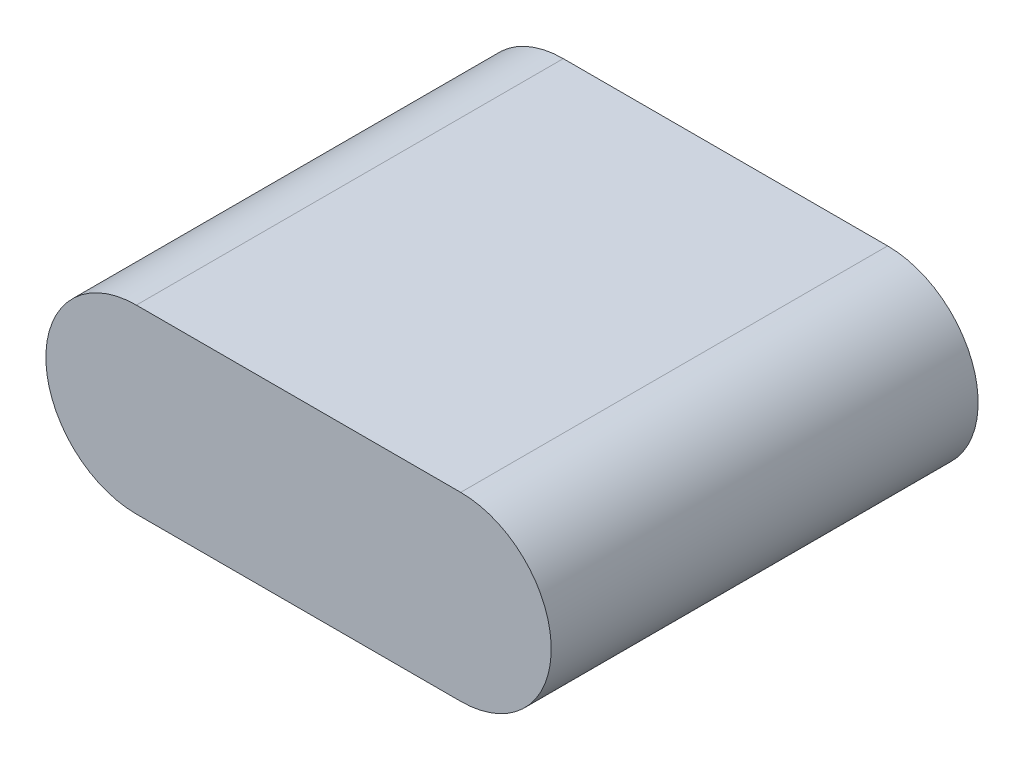
ISO-10303-21;
HEADER;
FILE_DESCRIPTION(('STEP AP214'),'2;1');
FILE_NAME('part.step','',(''),(''),'','','');
FILE_SCHEMA(('AUTOMOTIVE_DESIGN { 1 0 10303 214 1 1 1 1 }'));
ENDSEC;
DATA;
#1=APPLICATION_CONTEXT('core data for automotive mechanical design processes');
#2=APPLICATION_PROTOCOL_DEFINITION('international standard','automotive_design',2000,#1);
#3=PRODUCT_CONTEXT('',#1,'mechanical');
#4=PRODUCT('Part','Part','',(#3));
#5=PRODUCT_RELATED_PRODUCT_CATEGORY('part','',(#4));
#6=PRODUCT_DEFINITION_FORMATION('','',#4);
#7=PRODUCT_DEFINITION_CONTEXT('part definition',#1,'design');
#8=PRODUCT_DEFINITION('design','',#6,#7);
#9=PRODUCT_DEFINITION_SHAPE('','',#8);
#10=(LENGTH_UNIT() NAMED_UNIT(*) SI_UNIT(.MILLI.,.METRE.));
#11=(NAMED_UNIT(*) PLANE_ANGLE_UNIT() SI_UNIT($,.RADIAN.));
#12=(NAMED_UNIT(*) SI_UNIT($,.STERADIAN.) SOLID_ANGLE_UNIT());
#13=UNCERTAINTY_MEASURE_WITH_UNIT(LENGTH_MEASURE(1.E-05),#10,'distance_accuracy_value','');
#14=(GEOMETRIC_REPRESENTATION_CONTEXT(3) GLOBAL_UNCERTAINTY_ASSIGNED_CONTEXT((#13)) GLOBAL_UNIT_ASSIGNED_CONTEXT((#10,
#11,#12)) REPRESENTATION_CONTEXT('',''));
#15=CARTESIAN_POINT('',(0.,0.,0.));
#16=DIRECTION('',(0.,0.,1.));
#17=DIRECTION('',(1.,0.,0.));
#18=AXIS2_PLACEMENT_3D('',#15,#16,#17);
#19=CARTESIAN_POINT('',(-260.03431365079,39.5101937963928,-333.831395650827));
#20=DIRECTION('',(-1.90958360235527E-13,-3.56992213568219E-13,1.));
#21=DIRECTION('',(0.,1.,3.56992213568219E-13));
#22=AXIS2_PLACEMENT_3D('',#19,#20,#21);
#23=PLANE('',#22);
#24=CARTESIAN_POINT('',(-260.03431365079,39.5101937963928,-333.831395650827));
#25=DIRECTION('',(1.90958360235527E-13,3.56992213568219E-13,-1.));
#26=DIRECTION('',(0.,1.,3.56992213568219E-13));
#27=AXIS2_PLACEMENT_3D('',#24,#25,#26);
#28=CIRCLE('',#27,50.);
#29=CARTESIAN_POINT('',(-260.03431365079,-10.4898062036072,-333.831395650844));
#30=VERTEX_POINT('',#29);
#31=CARTESIAN_POINT('',(-260.03431365079,89.5101937963928,-333.831395650809));
#32=VERTEX_POINT('',#31);
#33=EDGE_CURVE('E165',#30,#32,#28,.T.);
#34=ORIENTED_EDGE('',*,*,#33,.T.);
#35=DIRECTION('',(1.,0.,1.9099669192392E-13));
#36=VECTOR('',#35,1.);
#37=CARTESIAN_POINT('',(-260.03431365079,89.5101937963928,-333.831395650809));
#38=LINE('',#37,#36);
#39=CARTESIAN_POINT('',(-80.8551645810129,89.5101937963928,-333.831395650775));
#40=VERTEX_POINT('',#39);
#41=EDGE_CURVE('E11',#32,#40,#38,.T.);
#42=ORIENTED_EDGE('',*,*,#41,.T.);
#43=CARTESIAN_POINT('',(-80.8551645810128,39.5101937963928,-333.831395650792));
#44=DIRECTION('',(1.90958360235527E-13,3.56992213568219E-13,-1.));
#45=DIRECTION('',(0.,1.,3.56992213568219E-13));
#46=AXIS2_PLACEMENT_3D('',#43,#44,#45);
#47=CIRCLE('',#46,50.);
#48=CARTESIAN_POINT('',(-80.8551645810129,-10.4898062036072,-333.83139565081));
#49=VERTEX_POINT('',#48);
#50=EDGE_CURVE('E42',#40,#49,#47,.T.);
#51=ORIENTED_EDGE('',*,*,#50,.T.);
#52=DIRECTION('',(-1.,0.,-1.9099669192392E-13));
#53=VECTOR('',#52,1.);
#54=CARTESIAN_POINT('',(-80.8551645810129,-10.4898062036072,-333.83139565081));
#55=LINE('',#54,#53);
#56=EDGE_CURVE('E155',#49,#30,#55,.T.);
#57=ORIENTED_EDGE('',*,*,#56,.T.);
#58=EDGE_LOOP('',(#34,#42,#51,#57));
#59=FACE_BOUND('',#58,.T.);
#60=ADVANCED_FACE('F33',(#59),#23,.F.);
#61=CARTESIAN_POINT('',(-260.03431365079,39.5101937963928,-97.9999899999562));
#62=DIRECTION('',(-1.90958360235527E-13,-3.56992213568219E-13,-1.));
#63=DIRECTION('',(0.,1.,-3.56992213568219E-13));
#64=AXIS2_PLACEMENT_3D('',#61,#62,#63);
#65=PLANE('',#64);
#66=CARTESIAN_POINT('',(-260.03431365079,39.5101937963928,-97.9999899999562));
#67=DIRECTION('',(-1.90958360235527E-13,-3.56992213568219E-13,-1.));
#68=DIRECTION('',(0.,1.,-3.56992213568219E-13));
#69=AXIS2_PLACEMENT_3D('',#66,#67,#68);
#70=CIRCLE('',#69,50.);
#71=CARTESIAN_POINT('',(-260.03431365079,-10.4898062036072,-97.9999899999384));
#72=VERTEX_POINT('',#71);
#73=CARTESIAN_POINT('',(-260.03431365079,89.5101937963928,-97.999989999974));
#74=VERTEX_POINT('',#73);
#75=EDGE_CURVE('E80',#72,#74,#70,.T.);
#76=ORIENTED_EDGE('',*,*,#75,.F.);
#77=DIRECTION('',(-1.,0.,1.9099669192392E-13));
#78=VECTOR('',#77,1.);
#79=CARTESIAN_POINT('',(-80.8551645810129,-10.4898062036072,-97.9999899999726));
#80=LINE('',#79,#78);
#81=CARTESIAN_POINT('',(-80.8551645810129,-10.4898062036072,-97.9999899999726));
#82=VERTEX_POINT('',#81);
#83=EDGE_CURVE('E101',#82,#72,#80,.T.);
#84=ORIENTED_EDGE('',*,*,#83,.F.);
#85=CARTESIAN_POINT('',(-80.8551645810128,39.5101937963928,-97.9999899999904));
#86=DIRECTION('',(-1.90958360235527E-13,-3.56992213568219E-13,-1.));
#87=DIRECTION('',(0.,1.,-3.56992213568219E-13));
#88=AXIS2_PLACEMENT_3D('',#85,#86,#87);
#89=CIRCLE('',#88,50.);
#90=CARTESIAN_POINT('',(-80.8551645810129,89.5101937963928,-97.9999900000083));
#91=VERTEX_POINT('',#90);
#92=EDGE_CURVE('E83',#91,#82,#89,.T.);
#93=ORIENTED_EDGE('',*,*,#92,.F.);
#94=DIRECTION('',(1.,0.,-1.9099669192392E-13));
#95=VECTOR('',#94,1.);
#96=CARTESIAN_POINT('',(-260.03431365079,89.5101937963928,-97.999989999974));
#97=LINE('',#96,#95);
#98=EDGE_CURVE('E77',#74,#91,#97,.T.);
#99=ORIENTED_EDGE('',*,*,#98,.F.);
#100=EDGE_LOOP('',(#76,#84,#93,#99));
#101=FACE_BOUND('',#100,.T.);
#102=ADVANCED_FACE('F79',(#101),#65,.F.);
#103=CARTESIAN_POINT('',(-260.03431365079,39.5101937963928,-97.9999899999562));
#104=DIRECTION('',(-1.90958360235527E-13,-3.56992213568219E-13,-1.));
#105=DIRECTION('',(0.,1.,-3.56992213568219E-13));
#106=AXIS2_PLACEMENT_3D('',#103,#104,#105);
#107=CYLINDRICAL_SURFACE('',#106,49.9999999999579);
#108=DIRECTION('',(-3.81916720471053E-13,-7.13984427136439E-13,-1.));
#109=VECTOR('',#108,1.);
#110=CARTESIAN_POINT('',(-260.03431365079,89.5101937963928,-97.999989999974));
#111=LINE('',#110,#109);
#112=EDGE_CURVE('E50',#74,#32,#111,.T.);
#113=ORIENTED_EDGE('',*,*,#112,.T.);
#114=ORIENTED_EDGE('',*,*,#33,.F.);
#115=DIRECTION('',(0.,0.,-1.));
#116=VECTOR('',#115,1.);
#117=CARTESIAN_POINT('',(-260.03431365079,-10.4898062036072,-97.9999899999384));
#118=LINE('',#117,#116);
#119=EDGE_CURVE('E95',#72,#30,#118,.T.);
#120=ORIENTED_EDGE('',*,*,#119,.F.);
#121=ORIENTED_EDGE('',*,*,#75,.T.);
#122=EDGE_LOOP('',(#113,#114,#120,#121));
#123=FACE_BOUND('',#122,.T.);
#124=ADVANCED_FACE('F93',(#123),#107,.T.);
#125=CARTESIAN_POINT('',(0.,-10.4898062036072,0.));
#126=DIRECTION('',(0.,1.,0.));
#127=DIRECTION('',(-1.,0.,0.));
#128=AXIS2_PLACEMENT_3D('',#125,#126,#127);
#129=PLANE('',#128);
#130=ORIENTED_EDGE('',*,*,#119,.T.);
#131=ORIENTED_EDGE('',*,*,#56,.F.);
#132=DIRECTION('',(-3.81916720471054E-13,-7.13984427136438E-13,-1.));
#133=VECTOR('',#132,1.);
#134=CARTESIAN_POINT('',(-80.8551645810129,-10.4898062036072,-97.9999899999726));
#135=LINE('',#134,#133);
#136=EDGE_CURVE('E248',#82,#49,#135,.T.);
#137=ORIENTED_EDGE('',*,*,#136,.F.);
#138=ORIENTED_EDGE('',*,*,#83,.T.);
#139=EDGE_LOOP('',(#130,#131,#137,#138));
#140=FACE_BOUND('',#139,.T.);
#141=ADVANCED_FACE('F126',(#140),#129,.F.);
#142=CARTESIAN_POINT('',(0.,89.5101937963928,0.));
#143=DIRECTION('',(0.,-1.,0.));
#144=DIRECTION('',(0.,0.,-1.));
#145=AXIS2_PLACEMENT_3D('',#142,#143,#144);
#146=PLANE('',#145);
#147=DIRECTION('',(0.,0.,-1.));
#148=VECTOR('',#147,1.);
#149=CARTESIAN_POINT('',(-80.8551645810129,89.5101937963928,-97.9999900000083));
#150=LINE('',#149,#148);
#151=EDGE_CURVE('E103',#91,#40,#150,.T.);
#152=ORIENTED_EDGE('',*,*,#151,.T.);
#153=ORIENTED_EDGE('',*,*,#41,.F.);
#154=ORIENTED_EDGE('',*,*,#112,.F.);
#155=ORIENTED_EDGE('',*,*,#98,.T.);
#156=EDGE_LOOP('',(#152,#153,#154,#155));
#157=FACE_BOUND('',#156,.T.);
#158=ADVANCED_FACE('F99',(#157),#146,.F.);
#159=CARTESIAN_POINT('',(-80.8551645810128,39.5101937963928,-97.9999899999904));
#160=DIRECTION('',(-1.90958360235527E-13,-3.56992213568219E-13,-1.));
#161=DIRECTION('',(0.,1.,-3.56992213568219E-13));
#162=AXIS2_PLACEMENT_3D('',#159,#160,#161);
#163=CYLINDRICAL_SURFACE('',#162,50.0000000000421);
#164=ORIENTED_EDGE('',*,*,#136,.T.);
#165=ORIENTED_EDGE('',*,*,#50,.F.);
#166=ORIENTED_EDGE('',*,*,#151,.F.);
#167=ORIENTED_EDGE('',*,*,#92,.T.);
#168=EDGE_LOOP('',(#164,#165,#166,#167));
#169=FACE_BOUND('',#168,.T.);
#170=ADVANCED_FACE('F125',(#169),#163,.T.);
#171=CLOSED_SHELL('',(#60,#102,#124,#141,#158,#170));
#172=MANIFOLD_SOLID_BREP('B2',#171);
#173=ADVANCED_BREP_SHAPE_REPRESENTATION('',(#18,#172),#14);
#174=SHAPE_DEFINITION_REPRESENTATION(#9,#173);
ENDSEC;
END-ISO-10303-21;
